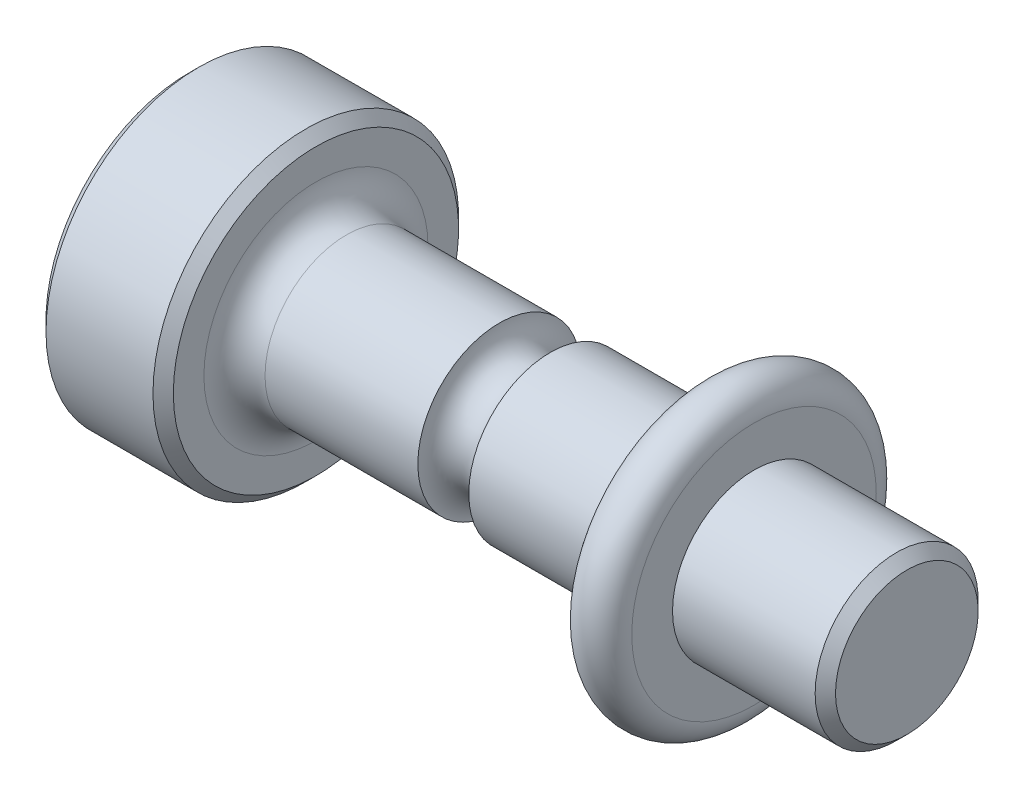
ISO-10303-21;
HEADER;
FILE_DESCRIPTION(('STEP AP214'),'2;1');
FILE_NAME('part.step','',(''),(''),'','','');
FILE_SCHEMA(('AUTOMOTIVE_DESIGN { 1 0 10303 214 1 1 1 1 }'));
ENDSEC;
DATA;
#1=APPLICATION_CONTEXT('core data for automotive mechanical design processes');
#2=APPLICATION_PROTOCOL_DEFINITION('international standard','automotive_design',2000,#1);
#3=PRODUCT_CONTEXT('',#1,'mechanical');
#4=PRODUCT('Part','Part','',(#3));
#5=PRODUCT_RELATED_PRODUCT_CATEGORY('part','',(#4));
#6=PRODUCT_DEFINITION_FORMATION('','',#4);
#7=PRODUCT_DEFINITION_CONTEXT('part definition',#1,'design');
#8=PRODUCT_DEFINITION('design','',#6,#7);
#9=PRODUCT_DEFINITION_SHAPE('','',#8);
#10=(LENGTH_UNIT() NAMED_UNIT(*) SI_UNIT(.MILLI.,.METRE.));
#11=(NAMED_UNIT(*) PLANE_ANGLE_UNIT() SI_UNIT($,.RADIAN.));
#12=(NAMED_UNIT(*) SI_UNIT($,.STERADIAN.) SOLID_ANGLE_UNIT());
#13=UNCERTAINTY_MEASURE_WITH_UNIT(LENGTH_MEASURE(1.E-05),#10,'distance_accuracy_value','');
#14=(GEOMETRIC_REPRESENTATION_CONTEXT(3) GLOBAL_UNCERTAINTY_ASSIGNED_CONTEXT((#13)) GLOBAL_UNIT_ASSIGNED_CONTEXT((#10,
#11,#12)) REPRESENTATION_CONTEXT('',''));
#15=CARTESIAN_POINT('',(0.,0.,0.));
#16=DIRECTION('',(0.,0.,1.));
#17=DIRECTION('',(1.,0.,0.));
#18=AXIS2_PLACEMENT_3D('',#15,#16,#17);
#19=CARTESIAN_POINT('',(0.,30.,0.));
#20=DIRECTION('',(1.,0.,0.));
#21=DIRECTION('',(0.,0.,-1.));
#22=AXIS2_PLACEMENT_3D('',#19,#20,#21);
#23=PLANE('',#22);
#24=CARTESIAN_POINT('',(0.,0.,0.));
#25=DIRECTION('',(1.,0.,0.));
#26=DIRECTION('',(0.,0.,-1.));
#27=AXIS2_PLACEMENT_3D('',#24,#25,#26);
#28=CIRCLE('',#27,28.);
#29=CARTESIAN_POINT('',(0.,0.,-28.));
#30=VERTEX_POINT('',#29);
#31=EDGE_CURVE('E64',#30,#30,#28,.F.);
#32=ORIENTED_EDGE('',*,*,#31,.T.);
#33=EDGE_LOOP('',(#32));
#34=FACE_BOUND('',#33,.T.);
#35=ADVANCED_FACE('F45',(#34),#23,.F.);
#36=CARTESIAN_POINT('',(-31.3207547169811,0.,0.));
#37=DIRECTION('',(-1.,0.,0.));
#38=DIRECTION('',(0.,0.,1.));
#39=AXIS2_PLACEMENT_3D('',#36,#37,#38);
#40=CYLINDRICAL_SURFACE('',#39,30.);
#41=CARTESIAN_POINT('',(1.99999999999999,0.,0.));
#42=DIRECTION('',(1.,0.,0.));
#43=DIRECTION('',(0.,0.,-1.));
#44=AXIS2_PLACEMENT_3D('',#41,#42,#43);
#45=CIRCLE('',#44,30.);
#46=CARTESIAN_POINT('',(1.99999999999999,0.,-30.));
#47=VERTEX_POINT('',#46);
#48=EDGE_CURVE('E54',#47,#47,#45,.T.);
#49=ORIENTED_EDGE('',*,*,#48,.T.);
#50=EDGE_LOOP('',(#49));
#51=FACE_BOUND('',#50,.T.);
#52=CARTESIAN_POINT('',(23.,0.,0.));
#53=DIRECTION('',(-1.,0.,0.));
#54=DIRECTION('',(0.,0.,1.));
#55=AXIS2_PLACEMENT_3D('',#52,#53,#54);
#56=CIRCLE('',#55,30.);
#57=CARTESIAN_POINT('',(23.,0.,30.));
#58=VERTEX_POINT('',#57);
#59=EDGE_CURVE('E59',#58,#58,#56,.T.);
#60=ORIENTED_EDGE('',*,*,#59,.T.);
#61=EDGE_LOOP('',(#60));
#62=FACE_BOUND('',#61,.T.);
#63=ADVANCED_FACE('F129',(#51,#62),#40,.T.);
#64=CARTESIAN_POINT('',(25.,22.,0.));
#65=DIRECTION('',(-1.,0.,0.));
#66=DIRECTION('',(0.,0.,1.));
#67=AXIS2_PLACEMENT_3D('',#64,#65,#66);
#68=PLANE('',#67);
#69=CARTESIAN_POINT('',(25.,0.,0.));
#70=DIRECTION('',(-1.,0.,0.));
#71=DIRECTION('',(0.,0.,1.));
#72=AXIS2_PLACEMENT_3D('',#69,#70,#71);
#73=CIRCLE('',#72,28.);
#74=CARTESIAN_POINT('',(25.,0.,28.));
#75=VERTEX_POINT('',#74);
#76=EDGE_CURVE('E10',#75,#75,#73,.F.);
#77=ORIENTED_EDGE('',*,*,#76,.T.);
#78=EDGE_LOOP('',(#77));
#79=FACE_BOUND('',#78,.T.);
#80=CARTESIAN_POINT('',(25.,0.,0.));
#81=DIRECTION('',(-1.,0.,0.));
#82=DIRECTION('',(0.,0.,1.));
#83=AXIS2_PLACEMENT_3D('',#80,#81,#82);
#84=CIRCLE('',#83,22.);
#85=CARTESIAN_POINT('',(25.,0.,22.));
#86=VERTEX_POINT('',#85);
#87=EDGE_CURVE('E78',#86,#86,#84,.T.);
#88=ORIENTED_EDGE('',*,*,#87,.T.);
#89=EDGE_LOOP('',(#88));
#90=FACE_BOUND('',#89,.T.);
#91=ADVANCED_FACE('F135',(#79,#90),#68,.F.);
#92=CARTESIAN_POINT('',(31.,0.,0.));
#93=DIRECTION('',(-1.,0.,0.));
#94=DIRECTION('',(0.,0.,1.));
#95=AXIS2_PLACEMENT_3D('',#92,#93,#94);
#96=TOROIDAL_SURFACE('',#95,22.,6.);
#97=ORIENTED_EDGE('',*,*,#87,.F.);
#98=EDGE_LOOP('',(#97));
#99=FACE_BOUND('',#98,.T.);
#100=CARTESIAN_POINT('',(31.,0.,0.));
#101=DIRECTION('',(-1.,0.,0.));
#102=DIRECTION('',(0.,0.,1.));
#103=AXIS2_PLACEMENT_3D('',#100,#101,#102);
#104=CIRCLE('',#103,16.);
#105=CARTESIAN_POINT('',(31.,0.,16.));
#106=VERTEX_POINT('',#105);
#107=EDGE_CURVE('E82',#106,#106,#104,.T.);
#108=ORIENTED_EDGE('',*,*,#107,.T.);
#109=EDGE_LOOP('',(#108));
#110=FACE_BOUND('',#109,.T.);
#111=ADVANCED_FACE('F210',(#99,#110),#96,.F.);
#112=CARTESIAN_POINT('',(-31.3207547169811,0.,0.));
#113=DIRECTION('',(-1.,0.,0.));
#114=DIRECTION('',(0.,0.,1.));
#115=AXIS2_PLACEMENT_3D('',#112,#113,#114);
#116=CYLINDRICAL_SURFACE('',#115,16.);
#117=ORIENTED_EDGE('',*,*,#107,.F.);
#118=EDGE_LOOP('',(#117));
#119=FACE_BOUND('',#118,.T.);
#120=CARTESIAN_POINT('',(61.,0.,0.));
#121=DIRECTION('',(-1.,0.,0.));
#122=DIRECTION('',(0.,0.,1.));
#123=AXIS2_PLACEMENT_3D('',#120,#121,#122);
#124=CIRCLE('',#123,16.);
#125=CARTESIAN_POINT('',(61.,0.,16.));
#126=VERTEX_POINT('',#125);
#127=EDGE_CURVE('E86',#126,#126,#124,.T.);
#128=ORIENTED_EDGE('',*,*,#127,.T.);
#129=EDGE_LOOP('',(#128));
#130=FACE_BOUND('',#129,.T.);
#131=ADVANCED_FACE('F228',(#119,#130),#116,.T.);
#132=CARTESIAN_POINT('',(66.,0.,0.));
#133=DIRECTION('',(-1.,0.,0.));
#134=DIRECTION('',(0.,0.,1.));
#135=AXIS2_PLACEMENT_3D('',#132,#133,#134);
#136=TOROIDAL_SURFACE('',#135,16.,5.);
#137=ORIENTED_EDGE('',*,*,#127,.F.);
#138=EDGE_LOOP('',(#137));
#139=FACE_BOUND('',#138,.T.);
#140=CARTESIAN_POINT('',(71.,0.,0.));
#141=DIRECTION('',(-1.,0.,0.));
#142=DIRECTION('',(0.,0.,1.));
#143=AXIS2_PLACEMENT_3D('',#140,#141,#142);
#144=CIRCLE('',#143,16.);
#145=CARTESIAN_POINT('',(71.,0.,16.));
#146=VERTEX_POINT('',#145);
#147=EDGE_CURVE('E90',#146,#146,#144,.T.);
#148=ORIENTED_EDGE('',*,*,#147,.T.);
#149=EDGE_LOOP('',(#148));
#150=FACE_BOUND('',#149,.T.);
#151=ADVANCED_FACE('F233',(#139,#150),#136,.F.);
#152=CARTESIAN_POINT('',(-31.3207547169811,0.,0.));
#153=DIRECTION('',(-1.,0.,0.));
#154=DIRECTION('',(0.,0.,1.));
#155=AXIS2_PLACEMENT_3D('',#152,#153,#154);
#156=CYLINDRICAL_SURFACE('',#155,16.);
#157=ORIENTED_EDGE('',*,*,#147,.F.);
#158=EDGE_LOOP('',(#157));
#159=FACE_BOUND('',#158,.T.);
#160=CARTESIAN_POINT('',(101.,0.,0.));
#161=DIRECTION('',(-1.,0.,0.));
#162=DIRECTION('',(0.,0.,1.));
#163=AXIS2_PLACEMENT_3D('',#160,#161,#162);
#164=CIRCLE('',#163,16.);
#165=CARTESIAN_POINT('',(101.,0.,16.));
#166=VERTEX_POINT('',#165);
#167=EDGE_CURVE('E94',#166,#166,#164,.T.);
#168=ORIENTED_EDGE('',*,*,#167,.T.);
#169=EDGE_LOOP('',(#168));
#170=FACE_BOUND('',#169,.T.);
#171=ADVANCED_FACE('F199',(#159,#170),#156,.T.);
#172=CARTESIAN_POINT('',(101.,16.,0.));
#173=DIRECTION('',(1.,0.,0.));
#174=DIRECTION('',(0.,0.,-1.));
#175=AXIS2_PLACEMENT_3D('',#172,#173,#174);
#176=PLANE('',#175);
#177=ORIENTED_EDGE('',*,*,#167,.F.);
#178=EDGE_LOOP('',(#177));
#179=FACE_BOUND('',#178,.T.);
#180=CARTESIAN_POINT('',(101.,0.,0.));
#181=DIRECTION('',(-1.,0.,0.));
#182=DIRECTION('',(0.,0.,1.));
#183=AXIS2_PLACEMENT_3D('',#180,#181,#182);
#184=CIRCLE('',#183,24.);
#185=CARTESIAN_POINT('',(101.,0.,24.));
#186=VERTEX_POINT('',#185);
#187=EDGE_CURVE('E98',#186,#186,#184,.T.);
#188=ORIENTED_EDGE('',*,*,#187,.T.);
#189=EDGE_LOOP('',(#188));
#190=FACE_BOUND('',#189,.T.);
#191=ADVANCED_FACE('F175',(#179,#190),#176,.F.);
#192=CARTESIAN_POINT('',(106.,0.,0.));
#193=DIRECTION('',(-1.,0.,0.));
#194=DIRECTION('',(0.,0.,1.));
#195=AXIS2_PLACEMENT_3D('',#192,#193,#194);
#196=TOROIDAL_SURFACE('',#195,24.,5.);
#197=ORIENTED_EDGE('',*,*,#187,.F.);
#198=EDGE_LOOP('',(#197));
#199=FACE_BOUND('',#198,.T.);
#200=CARTESIAN_POINT('',(111.,0.,0.));
#201=DIRECTION('',(-1.,0.,0.));
#202=DIRECTION('',(0.,0.,1.));
#203=AXIS2_PLACEMENT_3D('',#200,#201,#202);
#204=CIRCLE('',#203,24.);
#205=CARTESIAN_POINT('',(111.,0.,24.));
#206=VERTEX_POINT('',#205);
#207=EDGE_CURVE('E102',#206,#206,#204,.T.);
#208=ORIENTED_EDGE('',*,*,#207,.T.);
#209=EDGE_LOOP('',(#208));
#210=FACE_BOUND('',#209,.T.);
#211=ADVANCED_FACE('F125',(#199,#210),#196,.T.);
#212=CARTESIAN_POINT('',(111.,24.,0.));
#213=DIRECTION('',(-1.,0.,0.));
#214=DIRECTION('',(0.,0.,1.));
#215=AXIS2_PLACEMENT_3D('',#212,#213,#214);
#216=PLANE('',#215);
#217=ORIENTED_EDGE('',*,*,#207,.F.);
#218=EDGE_LOOP('',(#217));
#219=FACE_BOUND('',#218,.T.);
#220=CARTESIAN_POINT('',(111.,0.,0.));
#221=DIRECTION('',(-1.,0.,0.));
#222=DIRECTION('',(0.,0.,1.));
#223=AXIS2_PLACEMENT_3D('',#220,#221,#222);
#224=CIRCLE('',#223,16.0000000000001);
#225=CARTESIAN_POINT('',(111.,0.,16.0000000000001));
#226=VERTEX_POINT('',#225);
#227=EDGE_CURVE('E106',#226,#226,#224,.T.);
#228=ORIENTED_EDGE('',*,*,#227,.T.);
#229=EDGE_LOOP('',(#228));
#230=FACE_BOUND('',#229,.T.);
#231=ADVANCED_FACE('F111',(#219,#230),#216,.F.);
#232=CARTESIAN_POINT('',(-31.3207547169811,0.,0.));
#233=DIRECTION('',(-1.,0.,0.));
#234=DIRECTION('',(0.,0.,1.));
#235=AXIS2_PLACEMENT_3D('',#232,#233,#234);
#236=CYLINDRICAL_SURFACE('',#235,16.0000000000001);
#237=CARTESIAN_POINT('',(139.,0.,0.));
#238=DIRECTION('',(-1.,0.,0.));
#239=DIRECTION('',(0.,0.,1.));
#240=AXIS2_PLACEMENT_3D('',#237,#238,#239);
#241=CIRCLE('',#240,16.0000000000001);
#242=CARTESIAN_POINT('',(139.,0.,16.0000000000001));
#243=VERTEX_POINT('',#242);
#244=EDGE_CURVE('E74',#243,#243,#241,.T.);
#245=ORIENTED_EDGE('',*,*,#244,.T.);
#246=EDGE_LOOP('',(#245));
#247=FACE_BOUND('',#246,.T.);
#248=ORIENTED_EDGE('',*,*,#227,.F.);
#249=EDGE_LOOP('',(#248));
#250=FACE_BOUND('',#249,.T.);
#251=ADVANCED_FACE('F113',(#247,#250),#236,.T.);
#252=CARTESIAN_POINT('',(141.,0.,0.));
#253=DIRECTION('',(-1.,0.,0.));
#254=DIRECTION('',(0.,0.,1.));
#255=AXIS2_PLACEMENT_3D('',#252,#253,#254);
#256=PLANE('',#255);
#257=CARTESIAN_POINT('',(141.,0.,0.));
#258=DIRECTION('',(-1.,0.,0.));
#259=DIRECTION('',(0.,0.,1.));
#260=AXIS2_PLACEMENT_3D('',#257,#258,#259);
#261=CIRCLE('',#260,14.0000000000001);
#262=CARTESIAN_POINT('',(141.,0.,14.0000000000001));
#263=VERTEX_POINT('',#262);
#264=EDGE_CURVE('E70',#263,#263,#261,.F.);
#265=ORIENTED_EDGE('',*,*,#264,.T.);
#266=EDGE_LOOP('',(#265));
#267=FACE_BOUND('',#266,.T.);
#268=ADVANCED_FACE('F115',(#267),#256,.F.);
#269=CARTESIAN_POINT('',(139.,0.,0.));
#270=DIRECTION('',(-1.,0.,0.));
#271=DIRECTION('',(0.,0.,1.));
#272=AXIS2_PLACEMENT_3D('',#269,#270,#271);
#273=CONICAL_SURFACE('',#272,16.0000000000001,0.785398163397445);
#274=ORIENTED_EDGE('',*,*,#264,.F.);
#275=EDGE_LOOP('',(#274));
#276=FACE_BOUND('',#275,.T.);
#277=ORIENTED_EDGE('',*,*,#244,.F.);
#278=EDGE_LOOP('',(#277));
#279=FACE_BOUND('',#278,.T.);
#280=ADVANCED_FACE('F122',(#276,#279),#273,.T.);
#281=CARTESIAN_POINT('',(0.,0.,0.));
#282=DIRECTION('',(1.,0.,0.));
#283=DIRECTION('',(0.,0.,-1.));
#284=AXIS2_PLACEMENT_3D('',#281,#282,#283);
#285=CONICAL_SURFACE('',#284,28.,0.785398163397444);
#286=ORIENTED_EDGE('',*,*,#48,.F.);
#287=EDGE_LOOP('',(#286));
#288=FACE_BOUND('',#287,.T.);
#289=ORIENTED_EDGE('',*,*,#31,.F.);
#290=EDGE_LOOP('',(#289));
#291=FACE_BOUND('',#290,.T.);
#292=ADVANCED_FACE('F144',(#288,#291),#285,.T.);
#293=CARTESIAN_POINT('',(23.,0.,0.));
#294=DIRECTION('',(-1.,0.,0.));
#295=DIRECTION('',(0.,0.,1.));
#296=AXIS2_PLACEMENT_3D('',#293,#294,#295);
#297=CONICAL_SURFACE('',#296,30.,0.785398163397449);
#298=ORIENTED_EDGE('',*,*,#76,.F.);
#299=EDGE_LOOP('',(#298));
#300=FACE_BOUND('',#299,.T.);
#301=ORIENTED_EDGE('',*,*,#59,.F.);
#302=EDGE_LOOP('',(#301));
#303=FACE_BOUND('',#302,.T.);
#304=ADVANCED_FACE('F48',(#300,#303),#297,.T.);
#305=CLOSED_SHELL('',(#35,#63,#91,#111,#131,#151,#171,#191,#211,#231,#251,#268,#280,#292,#304));
#306=MANIFOLD_SOLID_BREP('B2',#305);
#307=ADVANCED_BREP_SHAPE_REPRESENTATION('',(#18,#306),#14);
#308=SHAPE_DEFINITION_REPRESENTATION(#9,#307);
ENDSEC;
END-ISO-10303-21;
